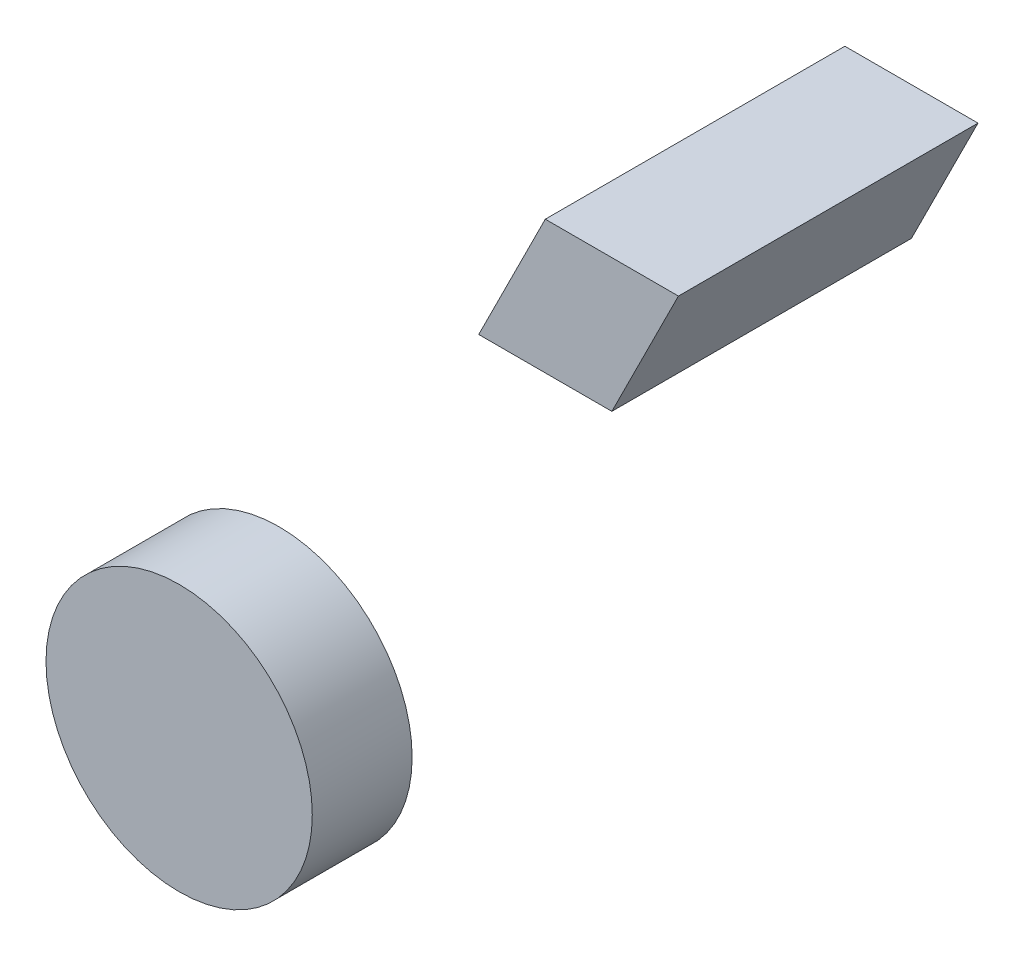
ISO-10303-21;
HEADER;
FILE_DESCRIPTION(('STEP AP214'),'2;1');
FILE_NAME('part.step','',(''),(''),'','','');
FILE_SCHEMA(('AUTOMOTIVE_DESIGN { 1 0 10303 214 1 1 1 1 }'));
ENDSEC;
DATA;
#1=APPLICATION_CONTEXT('core data for automotive mechanical design processes');
#2=APPLICATION_PROTOCOL_DEFINITION('international standard','automotive_design',2000,#1);
#3=PRODUCT_CONTEXT('',#1,'mechanical');
#4=PRODUCT('Part','Part','',(#3));
#5=PRODUCT_RELATED_PRODUCT_CATEGORY('part','',(#4));
#6=PRODUCT_DEFINITION_FORMATION('','',#4);
#7=PRODUCT_DEFINITION_CONTEXT('part definition',#1,'design');
#8=PRODUCT_DEFINITION('design','',#6,#7);
#9=PRODUCT_DEFINITION_SHAPE('','',#8);
#10=(LENGTH_UNIT() NAMED_UNIT(*) SI_UNIT(.MILLI.,.METRE.));
#11=(NAMED_UNIT(*) PLANE_ANGLE_UNIT() SI_UNIT($,.RADIAN.));
#12=(NAMED_UNIT(*) SI_UNIT($,.STERADIAN.) SOLID_ANGLE_UNIT());
#13=UNCERTAINTY_MEASURE_WITH_UNIT(LENGTH_MEASURE(1.E-05),#10,'distance_accuracy_value','');
#14=(GEOMETRIC_REPRESENTATION_CONTEXT(3) GLOBAL_UNCERTAINTY_ASSIGNED_CONTEXT((#13)) GLOBAL_UNIT_ASSIGNED_CONTEXT((#10,
#11,#12)) REPRESENTATION_CONTEXT('',''));
#15=CARTESIAN_POINT('',(0.,0.,0.));
#16=DIRECTION('',(0.,0.,1.));
#17=DIRECTION('',(1.,0.,0.));
#18=AXIS2_PLACEMENT_3D('',#15,#16,#17);
#19=CARTESIAN_POINT('',(0.,0.,24.));
#20=DIRECTION('',(0.,0.,-1.));
#21=DIRECTION('',(-1.,0.,0.));
#22=AXIS2_PLACEMENT_3D('',#19,#20,#21);
#23=CYLINDRICAL_SURFACE('',#22,8.);
#24=CARTESIAN_POINT('',(0.,0.,18.));
#25=DIRECTION('',(0.,0.,1.));
#26=DIRECTION('',(1.,0.,0.));
#27=AXIS2_PLACEMENT_3D('',#24,#25,#26);
#28=CIRCLE('',#27,8.);
#29=CARTESIAN_POINT('',(8.,0.,18.));
#30=VERTEX_POINT('',#29);
#31=EDGE_CURVE('E56',#30,#30,#28,.T.);
#32=ORIENTED_EDGE('',*,*,#31,.T.);
#33=EDGE_LOOP('',(#32));
#34=FACE_BOUND('',#33,.T.);
#35=CARTESIAN_POINT('',(0.,0.,24.));
#36=DIRECTION('',(0.,0.,1.));
#37=DIRECTION('',(1.,0.,0.));
#38=AXIS2_PLACEMENT_3D('',#35,#36,#37);
#39=CIRCLE('',#38,8.);
#40=CARTESIAN_POINT('',(8.,0.,24.));
#41=VERTEX_POINT('',#40);
#42=EDGE_CURVE('E12',#41,#41,#39,.T.);
#43=ORIENTED_EDGE('',*,*,#42,.F.);
#44=EDGE_LOOP('',(#43));
#45=FACE_BOUND('',#44,.T.);
#46=ADVANCED_FACE('F52',(#34,#45),#23,.T.);
#47=CARTESIAN_POINT('',(0.,0.,24.));
#48=DIRECTION('',(0.,0.,1.));
#49=DIRECTION('',(1.,0.,0.));
#50=AXIS2_PLACEMENT_3D('',#47,#48,#49);
#51=PLANE('',#50);
#52=ORIENTED_EDGE('',*,*,#42,.T.);
#53=EDGE_LOOP('',(#52));
#54=FACE_BOUND('',#53,.T.);
#55=ADVANCED_FACE('F68',(#54),#51,.T.);
#56=CARTESIAN_POINT('',(0.,0.,18.));
#57=DIRECTION('',(0.,0.,1.));
#58=DIRECTION('',(1.,0.,0.));
#59=AXIS2_PLACEMENT_3D('',#56,#57,#58);
#60=PLANE('',#59);
#61=ORIENTED_EDGE('',*,*,#31,.F.);
#62=EDGE_LOOP('',(#61));
#63=FACE_BOUND('',#62,.T.);
#64=ADVANCED_FACE('F54',(#63),#60,.F.);
#65=CLOSED_SHELL('',(#46,#55,#64));
#66=MANIFOLD_SOLID_BREP('B2',#65);
#67=CARTESIAN_POINT('',(0.,0.,0.));
#68=DIRECTION('',(0.,0.,1.));
#69=DIRECTION('',(1.,0.,0.));
#70=AXIS2_PLACEMENT_3D('',#67,#68,#69);
#71=PLANE('',#70);
#72=DIRECTION('',(-0.447213595499958,-0.894427190999916,0.));
#73=VECTOR('',#72,1.);
#74=CARTESIAN_POINT('',(12.,24.,0.));
#75=LINE('',#74,#73);
#76=CARTESIAN_POINT('',(16.,32.,0.));
#77=VERTEX_POINT('',#76);
#78=CARTESIAN_POINT('',(12.,24.,0.));
#79=VERTEX_POINT('',#78);
#80=EDGE_CURVE('E117',#77,#79,#75,.T.);
#81=ORIENTED_EDGE('',*,*,#80,.F.);
#82=DIRECTION('',(-1.,0.,0.));
#83=VECTOR('',#82,1.);
#84=CARTESIAN_POINT('',(16.,32.,0.));
#85=LINE('',#84,#83);
#86=CARTESIAN_POINT('',(24.,32.,0.));
#87=VERTEX_POINT('',#86);
#88=EDGE_CURVE('E137',#87,#77,#85,.T.);
#89=ORIENTED_EDGE('',*,*,#88,.F.);
#90=DIRECTION('',(0.447213595499958,0.894427190999916,0.));
#91=VECTOR('',#90,1.);
#92=CARTESIAN_POINT('',(24.,32.,0.));
#93=LINE('',#92,#91);
#94=CARTESIAN_POINT('',(20.,24.,0.));
#95=VERTEX_POINT('',#94);
#96=EDGE_CURVE('E143',#95,#87,#93,.T.);
#97=ORIENTED_EDGE('',*,*,#96,.F.);
#98=DIRECTION('',(1.,0.,0.));
#99=VECTOR('',#98,1.);
#100=CARTESIAN_POINT('',(20.,24.,0.));
#101=LINE('',#100,#99);
#102=EDGE_CURVE('E148',#79,#95,#101,.T.);
#103=ORIENTED_EDGE('',*,*,#102,.F.);
#104=EDGE_LOOP('',(#81,#89,#97,#103));
#105=FACE_BOUND('',#104,.T.);
#106=ADVANCED_FACE('F93',(#105),#71,.F.);
#107=CARTESIAN_POINT('',(20.,24.,0.));
#108=DIRECTION('',(0.,-1.,0.));
#109=DIRECTION('',(0.,0.,-1.));
#110=AXIS2_PLACEMENT_3D('',#107,#108,#109);
#111=PLANE('',#110);
#112=DIRECTION('',(1.,0.,0.));
#113=VECTOR('',#112,1.);
#114=CARTESIAN_POINT('',(20.,24.,18.));
#115=LINE('',#114,#113);
#116=CARTESIAN_POINT('',(12.,24.,18.));
#117=VERTEX_POINT('',#116);
#118=CARTESIAN_POINT('',(20.,24.,18.));
#119=VERTEX_POINT('',#118);
#120=EDGE_CURVE('E156',#117,#119,#115,.T.);
#121=ORIENTED_EDGE('',*,*,#120,.F.);
#122=DIRECTION('',(0.,0.,1.));
#123=VECTOR('',#122,1.);
#124=CARTESIAN_POINT('',(12.,24.,0.));
#125=LINE('',#124,#123);
#126=EDGE_CURVE('E96',#79,#117,#125,.T.);
#127=ORIENTED_EDGE('',*,*,#126,.F.);
#128=ORIENTED_EDGE('',*,*,#102,.T.);
#129=DIRECTION('',(0.,0.,1.));
#130=VECTOR('',#129,1.);
#131=CARTESIAN_POINT('',(20.,24.,0.));
#132=LINE('',#131,#130);
#133=EDGE_CURVE('E140',#95,#119,#132,.T.);
#134=ORIENTED_EDGE('',*,*,#133,.T.);
#135=EDGE_LOOP('',(#121,#127,#128,#134));
#136=FACE_BOUND('',#135,.T.);
#137=ADVANCED_FACE('F162',(#136),#111,.T.);
#138=CARTESIAN_POINT('',(24.,32.,0.));
#139=DIRECTION('',(0.894427190999916,-0.447213595499958,0.));
#140=DIRECTION('',(0.447213595499958,0.894427190999916,0.));
#141=AXIS2_PLACEMENT_3D('',#138,#139,#140);
#142=PLANE('',#141);
#143=DIRECTION('',(0.447213595499958,0.894427190999916,0.));
#144=VECTOR('',#143,1.);
#145=CARTESIAN_POINT('',(24.,32.,18.));
#146=LINE('',#145,#144);
#147=CARTESIAN_POINT('',(24.,32.,18.));
#148=VERTEX_POINT('',#147);
#149=EDGE_CURVE('E109',#119,#148,#146,.T.);
#150=ORIENTED_EDGE('',*,*,#149,.F.);
#151=ORIENTED_EDGE('',*,*,#133,.F.);
#152=ORIENTED_EDGE('',*,*,#96,.T.);
#153=DIRECTION('',(0.,0.,1.));
#154=VECTOR('',#153,1.);
#155=CARTESIAN_POINT('',(24.,32.,0.));
#156=LINE('',#155,#154);
#157=EDGE_CURVE('E101',#87,#148,#156,.T.);
#158=ORIENTED_EDGE('',*,*,#157,.T.);
#159=EDGE_LOOP('',(#150,#151,#152,#158));
#160=FACE_BOUND('',#159,.T.);
#161=ADVANCED_FACE('F144',(#160),#142,.T.);
#162=CARTESIAN_POINT('',(16.,32.,0.));
#163=DIRECTION('',(0.,1.,0.));
#164=DIRECTION('',(0.,0.,1.));
#165=AXIS2_PLACEMENT_3D('',#162,#163,#164);
#166=PLANE('',#165);
#167=DIRECTION('',(-1.,0.,0.));
#168=VECTOR('',#167,1.);
#169=CARTESIAN_POINT('',(16.,32.,18.));
#170=LINE('',#169,#168);
#171=CARTESIAN_POINT('',(16.,32.,18.));
#172=VERTEX_POINT('',#171);
#173=EDGE_CURVE('E139',#148,#172,#170,.T.);
#174=ORIENTED_EDGE('',*,*,#173,.F.);
#175=ORIENTED_EDGE('',*,*,#157,.F.);
#176=ORIENTED_EDGE('',*,*,#88,.T.);
#177=DIRECTION('',(0.,0.,1.));
#178=VECTOR('',#177,1.);
#179=CARTESIAN_POINT('',(16.,32.,0.));
#180=LINE('',#179,#178);
#181=EDGE_CURVE('E50',#77,#172,#180,.T.);
#182=ORIENTED_EDGE('',*,*,#181,.T.);
#183=EDGE_LOOP('',(#174,#175,#176,#182));
#184=FACE_BOUND('',#183,.T.);
#185=ADVANCED_FACE('F135',(#184),#166,.T.);
#186=CARTESIAN_POINT('',(12.,24.,0.));
#187=DIRECTION('',(-0.894427190999916,0.447213595499958,0.));
#188=DIRECTION('',(-0.447213595499958,-0.894427190999916,0.));
#189=AXIS2_PLACEMENT_3D('',#186,#187,#188);
#190=PLANE('',#189);
#191=DIRECTION('',(-0.447213595499958,-0.894427190999916,0.));
#192=VECTOR('',#191,1.);
#193=CARTESIAN_POINT('',(12.,24.,18.));
#194=LINE('',#193,#192);
#195=EDGE_CURVE('E153',#172,#117,#194,.T.);
#196=ORIENTED_EDGE('',*,*,#195,.F.);
#197=ORIENTED_EDGE('',*,*,#181,.F.);
#198=ORIENTED_EDGE('',*,*,#80,.T.);
#199=ORIENTED_EDGE('',*,*,#126,.T.);
#200=EDGE_LOOP('',(#196,#197,#198,#199));
#201=FACE_BOUND('',#200,.T.);
#202=ADVANCED_FACE('F166',(#201),#190,.T.);
#203=CARTESIAN_POINT('',(0.,0.,18.));
#204=DIRECTION('',(0.,0.,1.));
#205=DIRECTION('',(1.,0.,0.));
#206=AXIS2_PLACEMENT_3D('',#203,#204,#205);
#207=PLANE('',#206);
#208=ORIENTED_EDGE('',*,*,#173,.T.);
#209=ORIENTED_EDGE('',*,*,#195,.T.);
#210=ORIENTED_EDGE('',*,*,#120,.T.);
#211=ORIENTED_EDGE('',*,*,#149,.T.);
#212=EDGE_LOOP('',(#208,#209,#210,#211));
#213=FACE_BOUND('',#212,.T.);
#214=ADVANCED_FACE('F164',(#213),#207,.T.);
#215=CLOSED_SHELL('',(#106,#137,#161,#185,#202,#214));
#216=MANIFOLD_SOLID_BREP('B7',#215);
#217=ADVANCED_BREP_SHAPE_REPRESENTATION('',(#18,#66,#216),#14);
#218=SHAPE_DEFINITION_REPRESENTATION(#9,#217);
ENDSEC;
END-ISO-10303-21;
